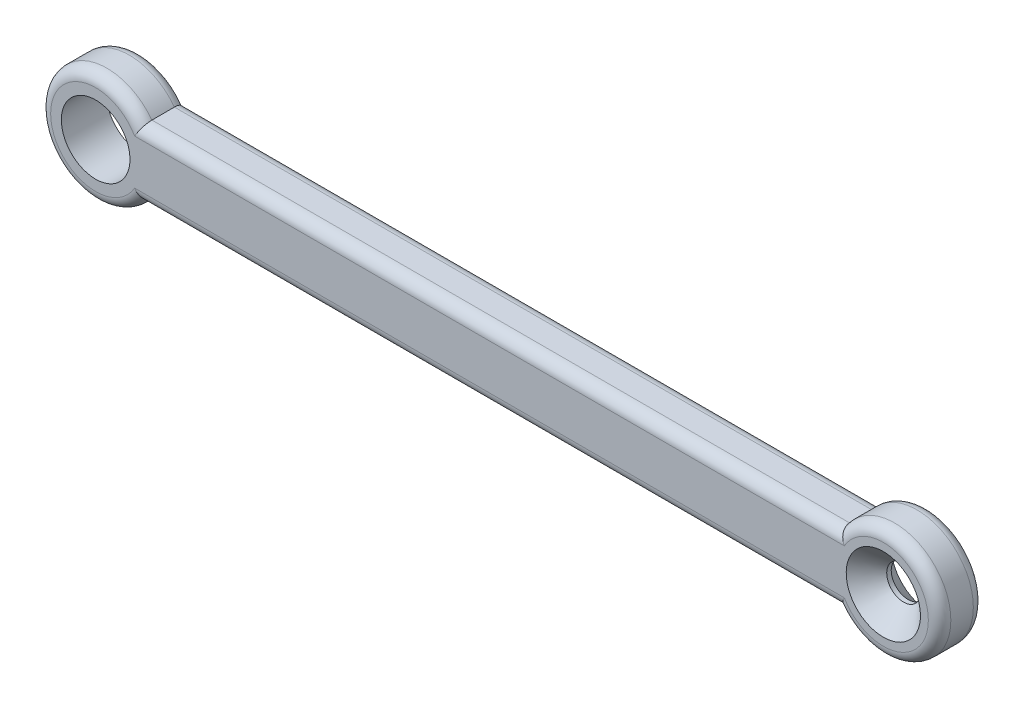
ISO-10303-21;
HEADER;
FILE_DESCRIPTION(('STEP AP214'),'2;1');
FILE_NAME('part.step','',(''),(''),'','','');
FILE_SCHEMA(('AUTOMOTIVE_DESIGN { 1 0 10303 214 1 1 1 1 }'));
ENDSEC;
DATA;
#1=APPLICATION_CONTEXT('core data for automotive mechanical design processes');
#2=APPLICATION_PROTOCOL_DEFINITION('international standard','automotive_design',2000,#1);
#3=PRODUCT_CONTEXT('',#1,'mechanical');
#4=PRODUCT('Part','Part','',(#3));
#5=PRODUCT_RELATED_PRODUCT_CATEGORY('part','',(#4));
#6=PRODUCT_DEFINITION_FORMATION('','',#4);
#7=PRODUCT_DEFINITION_CONTEXT('part definition',#1,'design');
#8=PRODUCT_DEFINITION('design','',#6,#7);
#9=PRODUCT_DEFINITION_SHAPE('','',#8);
#10=(LENGTH_UNIT() NAMED_UNIT(*) SI_UNIT(.MILLI.,.METRE.));
#11=(NAMED_UNIT(*) PLANE_ANGLE_UNIT() SI_UNIT($,.RADIAN.));
#12=(NAMED_UNIT(*) SI_UNIT($,.STERADIAN.) SOLID_ANGLE_UNIT());
#13=UNCERTAINTY_MEASURE_WITH_UNIT(LENGTH_MEASURE(1.E-05),#10,'distance_accuracy_value','');
#14=(GEOMETRIC_REPRESENTATION_CONTEXT(3) GLOBAL_UNCERTAINTY_ASSIGNED_CONTEXT((#13)) GLOBAL_UNIT_ASSIGNED_CONTEXT((#10,
#11,#12)) REPRESENTATION_CONTEXT('',''));
#15=CARTESIAN_POINT('',(0.,0.,0.));
#16=DIRECTION('',(0.,0.,1.));
#17=DIRECTION('',(1.,0.,0.));
#18=AXIS2_PLACEMENT_3D('',#15,#16,#17);
#19=CARTESIAN_POINT('',(-35.,0.,4.));
#20=DIRECTION('',(0.,0.,-1.));
#21=DIRECTION('',(-1.,0.,0.));
#22=AXIS2_PLACEMENT_3D('',#19,#20,#21);
#23=CYLINDRICAL_SURFACE('',#22,5.);
#24=DIRECTION('',(0.,0.,-1.));
#25=VECTOR('',#24,1.);
#26=CARTESIAN_POINT('',(-31.,-3.,4.));
#27=LINE('',#26,#25);
#28=CARTESIAN_POINT('',(-31.,-3.,3.));
#29=VERTEX_POINT('',#28);
#30=CARTESIAN_POINT('',(-31.,-3.,1.));
#31=VERTEX_POINT('',#30);
#32=EDGE_CURVE('E117',#29,#31,#27,.T.);
#33=ORIENTED_EDGE('',*,*,#32,.F.);
#34=CARTESIAN_POINT('',(-35.,0.,3.));
#35=DIRECTION('',(0.,0.,-1.));
#36=DIRECTION('',(-1.,0.,0.));
#37=AXIS2_PLACEMENT_3D('',#34,#35,#36);
#38=CIRCLE('',#37,5.);
#39=CARTESIAN_POINT('',(-31.,3.,3.));
#40=VERTEX_POINT('',#39);
#41=EDGE_CURVE('E133',#29,#40,#38,.T.);
#42=ORIENTED_EDGE('',*,*,#41,.T.);
#43=DIRECTION('',(0.,0.,-1.));
#44=VECTOR('',#43,1.);
#45=CARTESIAN_POINT('',(-31.,3.,4.));
#46=LINE('',#45,#44);
#47=CARTESIAN_POINT('',(-31.,3.,1.));
#48=VERTEX_POINT('',#47);
#49=EDGE_CURVE('E335',#40,#48,#46,.T.);
#50=ORIENTED_EDGE('',*,*,#49,.T.);
#51=CARTESIAN_POINT('',(-35.,0.,1.));
#52=DIRECTION('',(0.,0.,-1.));
#53=DIRECTION('',(-1.,0.,0.));
#54=AXIS2_PLACEMENT_3D('',#51,#52,#53);
#55=CIRCLE('',#54,5.);
#56=EDGE_CURVE('E136',#48,#31,#55,.F.);
#57=ORIENTED_EDGE('',*,*,#56,.T.);
#58=EDGE_LOOP('',(#33,#42,#50,#57));
#59=FACE_BOUND('',#58,.T.);
#60=ADVANCED_FACE('F39',(#59),#23,.T.);
#61=CARTESIAN_POINT('',(-31.,-3.,4.));
#62=DIRECTION('',(0.,-1.,0.));
#63=DIRECTION('',(1.,0.,0.));
#64=AXIS2_PLACEMENT_3D('',#61,#62,#63);
#65=PLANE('',#64);
#66=DIRECTION('',(0.,0.,-1.));
#67=VECTOR('',#66,1.);
#68=CARTESIAN_POINT('',(31.,-3.00000000000001,4.));
#69=LINE('',#68,#67);
#70=CARTESIAN_POINT('',(31.,-3.00000000000001,3.));
#71=VERTEX_POINT('',#70);
#72=CARTESIAN_POINT('',(31.,-3.00000000000001,1.));
#73=VERTEX_POINT('',#72);
#74=EDGE_CURVE('E120',#71,#73,#69,.T.);
#75=ORIENTED_EDGE('',*,*,#74,.F.);
#76=DIRECTION('',(-1.,0.,0.));
#77=VECTOR('',#76,1.);
#78=CARTESIAN_POINT('',(-31.,-3.,3.));
#79=LINE('',#78,#77);
#80=EDGE_CURVE('E114',#71,#29,#79,.T.);
#81=ORIENTED_EDGE('',*,*,#80,.T.);
#82=ORIENTED_EDGE('',*,*,#32,.T.);
#83=DIRECTION('',(-1.,0.,0.));
#84=VECTOR('',#83,1.);
#85=CARTESIAN_POINT('',(-31.,-3.,1.));
#86=LINE('',#85,#84);
#87=EDGE_CURVE('E127',#31,#73,#86,.F.);
#88=ORIENTED_EDGE('',*,*,#87,.T.);
#89=EDGE_LOOP('',(#75,#81,#82,#88));
#90=FACE_BOUND('',#89,.T.);
#91=ADVANCED_FACE('F116',(#90),#65,.T.);
#92=CARTESIAN_POINT('',(35.,0.,4.));
#93=DIRECTION('',(0.,0.,-1.));
#94=DIRECTION('',(-1.,0.,0.));
#95=AXIS2_PLACEMENT_3D('',#92,#93,#94);
#96=CYLINDRICAL_SURFACE('',#95,5.);
#97=DIRECTION('',(0.,0.,-1.));
#98=VECTOR('',#97,1.);
#99=CARTESIAN_POINT('',(31.,2.99999999999999,4.));
#100=LINE('',#99,#98);
#101=CARTESIAN_POINT('',(31.,2.99999999999999,3.));
#102=VERTEX_POINT('',#101);
#103=CARTESIAN_POINT('',(31.,2.99999999999999,1.));
#104=VERTEX_POINT('',#103);
#105=EDGE_CURVE('E339',#102,#104,#100,.T.);
#106=ORIENTED_EDGE('',*,*,#105,.F.);
#107=CARTESIAN_POINT('',(35.,0.,3.));
#108=DIRECTION('',(0.,0.,-1.));
#109=DIRECTION('',(-1.,0.,0.));
#110=AXIS2_PLACEMENT_3D('',#107,#108,#109);
#111=CIRCLE('',#110,5.);
#112=EDGE_CURVE('E181',#102,#71,#111,.T.);
#113=ORIENTED_EDGE('',*,*,#112,.T.);
#114=ORIENTED_EDGE('',*,*,#74,.T.);
#115=CARTESIAN_POINT('',(35.,0.,1.));
#116=DIRECTION('',(0.,0.,-1.));
#117=DIRECTION('',(-1.,0.,0.));
#118=AXIS2_PLACEMENT_3D('',#115,#116,#117);
#119=CIRCLE('',#118,5.);
#120=EDGE_CURVE('E126',#73,#104,#119,.F.);
#121=ORIENTED_EDGE('',*,*,#120,.T.);
#122=EDGE_LOOP('',(#106,#113,#114,#121));
#123=FACE_BOUND('',#122,.T.);
#124=ADVANCED_FACE('F274',(#123),#96,.T.);
#125=CARTESIAN_POINT('',(-31.,3.,4.));
#126=DIRECTION('',(0.,1.,0.));
#127=DIRECTION('',(-1.,0.,0.));
#128=AXIS2_PLACEMENT_3D('',#125,#126,#127);
#129=PLANE('',#128);
#130=ORIENTED_EDGE('',*,*,#49,.F.);
#131=DIRECTION('',(1.,0.,0.));
#132=VECTOR('',#131,1.);
#133=CARTESIAN_POINT('',(31.,2.99999999999999,3.));
#134=LINE('',#133,#132);
#135=EDGE_CURVE('E173',#40,#102,#134,.T.);
#136=ORIENTED_EDGE('',*,*,#135,.T.);
#137=ORIENTED_EDGE('',*,*,#105,.T.);
#138=DIRECTION('',(1.,0.,0.));
#139=VECTOR('',#138,1.);
#140=CARTESIAN_POINT('',(-31.,3.,1.));
#141=LINE('',#140,#139);
#142=EDGE_CURVE('E170',#104,#48,#141,.F.);
#143=ORIENTED_EDGE('',*,*,#142,.T.);
#144=EDGE_LOOP('',(#130,#136,#137,#143));
#145=FACE_BOUND('',#144,.T.);
#146=ADVANCED_FACE('F277',(#145),#129,.T.);
#147=CARTESIAN_POINT('',(-35.,0.,4.));
#148=DIRECTION('',(0.,0.,-1.));
#149=DIRECTION('',(-1.,0.,0.));
#150=AXIS2_PLACEMENT_3D('',#147,#148,#149);
#151=PLANE('',#150);
#152=DIRECTION('',(1.,0.,0.));
#153=VECTOR('',#152,1.);
#154=CARTESIAN_POINT('',(-31.,2.,4.));
#155=LINE('',#154,#153);
#156=CARTESIAN_POINT('',(31.5358983848623,1.99999999999999,4.));
#157=VERTEX_POINT('',#156);
#158=CARTESIAN_POINT('',(-31.5358983848622,2.,4.));
#159=VERTEX_POINT('',#158);
#160=EDGE_CURVE('E164',#157,#159,#155,.F.);
#161=ORIENTED_EDGE('',*,*,#160,.T.);
#162=CARTESIAN_POINT('',(-35.,0.,4.));
#163=DIRECTION('',(0.,0.,-1.));
#164=DIRECTION('',(-1.,0.,0.));
#165=AXIS2_PLACEMENT_3D('',#162,#163,#164);
#166=CIRCLE('',#165,4.);
#167=CARTESIAN_POINT('',(-31.5358983848622,-2.,4.));
#168=VERTEX_POINT('',#167);
#169=EDGE_CURVE('E167',#159,#168,#166,.F.);
#170=ORIENTED_EDGE('',*,*,#169,.T.);
#171=DIRECTION('',(-1.,0.,0.));
#172=VECTOR('',#171,1.);
#173=CARTESIAN_POINT('',(31.,-2.00000000000001,4.));
#174=LINE('',#173,#172);
#175=CARTESIAN_POINT('',(31.5358983848622,-2.00000000000001,4.));
#176=VERTEX_POINT('',#175);
#177=EDGE_CURVE('E142',#168,#176,#174,.F.);
#178=ORIENTED_EDGE('',*,*,#177,.T.);
#179=CARTESIAN_POINT('',(35.,0.,4.));
#180=DIRECTION('',(0.,0.,-1.));
#181=DIRECTION('',(-1.,0.,0.));
#182=AXIS2_PLACEMENT_3D('',#179,#180,#181);
#183=CIRCLE('',#182,4.);
#184=EDGE_CURVE('E154',#176,#157,#183,.F.);
#185=ORIENTED_EDGE('',*,*,#184,.T.);
#186=EDGE_LOOP('',(#161,#170,#178,#185));
#187=FACE_BOUND('',#186,.T.);
#188=CARTESIAN_POINT('',(35.,0.,4.));
#189=DIRECTION('',(0.,0.,1.));
#190=DIRECTION('',(0.,-1.,0.));
#191=AXIS2_PLACEMENT_3D('',#188,#189,#190);
#192=CIRCLE('',#191,3.3);
#193=CARTESIAN_POINT('',(35.,-3.30000000000001,4.));
#194=VERTEX_POINT('',#193);
#195=EDGE_CURVE('E313',#194,#194,#192,.T.);
#196=ORIENTED_EDGE('',*,*,#195,.F.);
#197=EDGE_LOOP('',(#196));
#198=FACE_BOUND('',#197,.T.);
#199=CARTESIAN_POINT('',(-35.,0.,4.));
#200=DIRECTION('',(0.,0.,1.));
#201=DIRECTION('',(0.,-1.,0.));
#202=AXIS2_PLACEMENT_3D('',#199,#200,#201);
#203=CIRCLE('',#202,3.04999999999998);
#204=CARTESIAN_POINT('',(-35.,-3.04999999999998,4.));
#205=VERTEX_POINT('',#204);
#206=EDGE_CURVE('E328',#205,#205,#203,.T.);
#207=ORIENTED_EDGE('',*,*,#206,.F.);
#208=EDGE_LOOP('',(#207));
#209=FACE_BOUND('',#208,.T.);
#210=ADVANCED_FACE('F280',(#187,#198,#209),#151,.F.);
#211=CARTESIAN_POINT('',(-35.,0.,0.));
#212=DIRECTION('',(0.,0.,-1.));
#213=DIRECTION('',(-1.,0.,0.));
#214=AXIS2_PLACEMENT_3D('',#211,#212,#213);
#215=PLANE('',#214);
#216=DIRECTION('',(1.,0.,0.));
#217=VECTOR('',#216,1.);
#218=CARTESIAN_POINT('',(-35.,2.,0.));
#219=LINE('',#218,#217);
#220=CARTESIAN_POINT('',(-31.5358983848622,2.,0.));
#221=VERTEX_POINT('',#220);
#222=CARTESIAN_POINT('',(31.5358983848623,1.99999999999999,0.));
#223=VERTEX_POINT('',#222);
#224=EDGE_CURVE('E54',#221,#223,#219,.T.);
#225=ORIENTED_EDGE('',*,*,#224,.T.);
#226=CARTESIAN_POINT('',(35.,0.,0.));
#227=DIRECTION('',(0.,0.,-1.));
#228=DIRECTION('',(-1.,0.,0.));
#229=AXIS2_PLACEMENT_3D('',#226,#227,#228);
#230=CIRCLE('',#229,4.);
#231=CARTESIAN_POINT('',(31.5358983848622,-2.00000000000001,0.));
#232=VERTEX_POINT('',#231);
#233=EDGE_CURVE('E11',#223,#232,#230,.T.);
#234=ORIENTED_EDGE('',*,*,#233,.T.);
#235=DIRECTION('',(-1.,0.,0.));
#236=VECTOR('',#235,1.);
#237=CARTESIAN_POINT('',(-35.,-2.,0.));
#238=LINE('',#237,#236);
#239=CARTESIAN_POINT('',(-31.5358983848622,-2.,0.));
#240=VERTEX_POINT('',#239);
#241=EDGE_CURVE('E187',#232,#240,#238,.T.);
#242=ORIENTED_EDGE('',*,*,#241,.T.);
#243=CARTESIAN_POINT('',(-35.,0.,0.));
#244=DIRECTION('',(0.,0.,-1.));
#245=DIRECTION('',(-1.,0.,0.));
#246=AXIS2_PLACEMENT_3D('',#243,#244,#245);
#247=CIRCLE('',#246,4.);
#248=EDGE_CURVE('E184',#240,#221,#247,.T.);
#249=ORIENTED_EDGE('',*,*,#248,.T.);
#250=EDGE_LOOP('',(#225,#234,#242,#249));
#251=FACE_BOUND('',#250,.T.);
#252=CARTESIAN_POINT('',(35.,0.,0.));
#253=DIRECTION('',(0.,0.,1.));
#254=DIRECTION('',(0.,-1.,0.));
#255=AXIS2_PLACEMENT_3D('',#252,#253,#254);
#256=CIRCLE('',#255,3.3);
#257=CARTESIAN_POINT('',(35.,-3.30000000000001,0.));
#258=VERTEX_POINT('',#257);
#259=EDGE_CURVE('E316',#258,#258,#256,.T.);
#260=ORIENTED_EDGE('',*,*,#259,.T.);
#261=EDGE_LOOP('',(#260));
#262=FACE_BOUND('',#261,.T.);
#263=CARTESIAN_POINT('',(-35.,0.,0.));
#264=DIRECTION('',(0.,0.,1.));
#265=DIRECTION('',(0.,-1.,0.));
#266=AXIS2_PLACEMENT_3D('',#263,#264,#265);
#267=CIRCLE('',#266,3.04999999999999);
#268=CARTESIAN_POINT('',(-35.,-3.04999999999999,0.));
#269=VERTEX_POINT('',#268);
#270=EDGE_CURVE('E332',#269,#269,#267,.T.);
#271=ORIENTED_EDGE('',*,*,#270,.T.);
#272=EDGE_LOOP('',(#271));
#273=FACE_BOUND('',#272,.T.);
#274=ADVANCED_FACE('F285',(#251,#262,#273),#215,.T.);
#275=CARTESIAN_POINT('',(-35.,0.,4.));
#276=DIRECTION('',(0.,0.,1.));
#277=DIRECTION('',(0.,-1.,0.));
#278=AXIS2_PLACEMENT_3D('',#275,#276,#277);
#279=CYLINDRICAL_SURFACE('',#278,3.04999999999999);
#280=ORIENTED_EDGE('',*,*,#270,.F.);
#281=EDGE_LOOP('',(#280));
#282=FACE_BOUND('',#281,.T.);
#283=ORIENTED_EDGE('',*,*,#206,.T.);
#284=EDGE_LOOP('',(#283));
#285=FACE_BOUND('',#284,.T.);
#286=ADVANCED_FACE('F288',(#282,#285),#279,.F.);
#287=CARTESIAN_POINT('',(35.,0.,1.8));
#288=DIRECTION('',(0.,0.,-1.));
#289=DIRECTION('',(0.,1.,0.));
#290=AXIS2_PLACEMENT_3D('',#287,#288,#289);
#291=CONICAL_SURFACE('',#290,1.5,0.785398163397447);
#292=ORIENTED_EDGE('',*,*,#259,.F.);
#293=EDGE_LOOP('',(#292));
#294=FACE_BOUND('',#293,.T.);
#295=CARTESIAN_POINT('',(35.,0.,1.8));
#296=DIRECTION('',(0.,0.,1.));
#297=DIRECTION('',(0.,-1.,0.));
#298=AXIS2_PLACEMENT_3D('',#295,#296,#297);
#299=CIRCLE('',#298,1.5);
#300=CARTESIAN_POINT('',(35.,-1.50000000000001,1.8));
#301=VERTEX_POINT('',#300);
#302=EDGE_CURVE('E320',#301,#301,#299,.T.);
#303=ORIENTED_EDGE('',*,*,#302,.T.);
#304=EDGE_LOOP('',(#303));
#305=FACE_BOUND('',#304,.T.);
#306=ADVANCED_FACE('F294',(#294,#305),#291,.F.);
#307=CARTESIAN_POINT('',(35.,0.,4.));
#308=DIRECTION('',(0.,0.,1.));
#309=DIRECTION('',(0.,-1.,0.));
#310=AXIS2_PLACEMENT_3D('',#307,#308,#309);
#311=CYLINDRICAL_SURFACE('',#310,1.5);
#312=ORIENTED_EDGE('',*,*,#302,.F.);
#313=EDGE_LOOP('',(#312));
#314=FACE_BOUND('',#313,.T.);
#315=CARTESIAN_POINT('',(35.,0.,2.2));
#316=DIRECTION('',(0.,0.,1.));
#317=DIRECTION('',(0.,-1.,0.));
#318=AXIS2_PLACEMENT_3D('',#315,#316,#317);
#319=CIRCLE('',#318,1.5);
#320=CARTESIAN_POINT('',(35.,-1.50000000000001,2.2));
#321=VERTEX_POINT('',#320);
#322=EDGE_CURVE('E310',#321,#321,#319,.T.);
#323=ORIENTED_EDGE('',*,*,#322,.T.);
#324=EDGE_LOOP('',(#323));
#325=FACE_BOUND('',#324,.T.);
#326=ADVANCED_FACE('F298',(#314,#325),#311,.F.);
#327=CARTESIAN_POINT('',(35.,0.,4.));
#328=DIRECTION('',(0.,0.,1.));
#329=DIRECTION('',(0.,-1.,0.));
#330=AXIS2_PLACEMENT_3D('',#327,#328,#329);
#331=CONICAL_SURFACE('',#330,3.3,0.785398163397447);
#332=ORIENTED_EDGE('',*,*,#322,.F.);
#333=EDGE_LOOP('',(#332));
#334=FACE_BOUND('',#333,.T.);
#335=ORIENTED_EDGE('',*,*,#195,.T.);
#336=EDGE_LOOP('',(#335));
#337=FACE_BOUND('',#336,.T.);
#338=ADVANCED_FACE('F231',(#334,#337),#331,.F.);
#339=CARTESIAN_POINT('',(35.,0.,3.));
#340=DIRECTION('',(0.,0.,-1.));
#341=DIRECTION('',(-1.,0.,0.));
#342=AXIS2_PLACEMENT_3D('',#339,#340,#341);
#343=TOROIDAL_SURFACE('',#342,4.,1.);
#344=CARTESIAN_POINT('',(31.,2.99999999999999,3.));
#345=CARTESIAN_POINT('',(30.9999997186835,3.00000118487758,3.02593584117217));
#346=CARTESIAN_POINT('',(31.0005048422214,2.99899024971478,3.05185848371749));
#347=CARTESIAN_POINT('',(31.0025174211415,2.9949663652297,3.10350244341266));
#348=CARTESIAN_POINT('',(31.0040246301367,2.99195390803017,3.12922380847896));
#349=CARTESIAN_POINT('',(31.0100201848329,2.97998050347588,3.20562797357342));
#350=CARTESIAN_POINT('',(31.0159826315797,2.96808309336857,3.2557718679136));
#351=CARTESIAN_POINT('',(31.0316200908392,2.93699471408966,3.35306188885311));
#352=CARTESIAN_POINT('',(31.0412933679872,2.91780715418681,3.40020940470925));
#353=CARTESIAN_POINT('',(31.0640294624263,2.87293379421446,3.49043466378816));
#354=CARTESIAN_POINT('',(31.0770940996145,2.84724450532373,3.53351020489424));
#355=CARTESIAN_POINT('',(31.1067833208305,2.7892269831718,3.61625708217515));
#356=CARTESIAN_POINT('',(31.1235261796482,2.75668016666699,3.65573197239517));
#357=CARTESIAN_POINT('',(31.1597750962425,2.6867497331279,3.72864880091133));
#358=CARTESIAN_POINT('',(31.1792818722659,2.64936485906855,3.76208916589023));
#359=CARTESIAN_POINT('',(31.2226452828904,2.56697350675941,3.82553326631048));
#360=CARTESIAN_POINT('',(31.246741407605,2.52157888102644,3.85486819768669));
#361=CARTESIAN_POINT('',(31.2971421630572,2.42763014490769,3.90553011803555));
#362=CARTESIAN_POINT('',(31.3234486667458,2.37907336308624,3.92685023024644));
#363=CARTESIAN_POINT('',(31.379466656447,2.27685685167101,3.96253254553221));
#364=CARTESIAN_POINT('',(31.4092883233148,2.2230703241737,3.97635450540737));
#365=CARTESIAN_POINT('',(31.4701463148326,2.11473605902904,3.99491079093398));
#366=CARTESIAN_POINT('',(31.5011801634543,2.06019000592373,3.99966274451616));
#367=CARTESIAN_POINT('',(31.5336334551975,2.00392392816218,3.99999423692863));
#368=CARTESIAN_POINT('',(31.5347657404586,2.0019617898671,4.00000001055694));
#369=CARTESIAN_POINT('',(31.5358983848623,1.99999999999999,4.));
#370=B_SPLINE_CURVE_WITH_KNOTS('',3,(#344,#345,#346,#347,#348,#349,#350,#351,#352,#353,#354,
#355,#356,#357,#358,#359,#360,#361,#362,#363,#364,#365,#366,#367,#368,#369),.UNSPECIFIED.,.F.,
.F.,(4,2,2,2,2,2,2,2,2,2,2,2,4),(0.,0.0777570801348416,0.155495048875958,0.310316804326361,
0.465066245681998,0.619898902143677,0.780727934079204,0.941598836856938,1.11840921049057,
1.29537094407907,1.48379700692642,1.67185648156941,1.67865268078424),.UNSPECIFIED.);
#371=EDGE_CURVE('E147',#157,#102,#370,.F.);
#372=ORIENTED_EDGE('',*,*,#371,.F.);
#373=ORIENTED_EDGE('',*,*,#184,.F.);
#374=CARTESIAN_POINT('',(31.,-3.00000000000001,3.));
#375=CARTESIAN_POINT('',(30.9999997186835,-3.00000118487759,3.02593584117217));
#376=CARTESIAN_POINT('',(31.0005048422214,-2.9989902497148,3.05185848371749));
#377=CARTESIAN_POINT('',(31.0025174211415,-2.99496636522971,3.10350244341266));
#378=CARTESIAN_POINT('',(31.0040246301367,-2.99195390803019,3.12922380847896));
#379=CARTESIAN_POINT('',(31.0100201848329,-2.9799805034759,3.20562797357342));
#380=CARTESIAN_POINT('',(31.0159826315797,-2.96808309336859,3.2557718679136));
#381=CARTESIAN_POINT('',(31.0316200908392,-2.93699471408968,3.35306188885311));
#382=CARTESIAN_POINT('',(31.0412933679872,-2.91780715418682,3.40020940470925));
#383=CARTESIAN_POINT('',(31.0640294624263,-2.87293379421448,3.49043466378816));
#384=CARTESIAN_POINT('',(31.0770940996145,-2.84724450532375,3.53351020489424));
#385=CARTESIAN_POINT('',(31.1067833208305,-2.78922698317182,3.61625708217515));
#386=CARTESIAN_POINT('',(31.1235261796482,-2.756680166667,3.65573197239517));
#387=CARTESIAN_POINT('',(31.1597750962425,-2.68674973312791,3.72864880091133));
#388=CARTESIAN_POINT('',(31.1792818722659,-2.64936485906856,3.76208916589023));
#389=CARTESIAN_POINT('',(31.2226452828904,-2.56697350675942,3.82553326631047));
#390=CARTESIAN_POINT('',(31.246741407605,-2.52157888102645,3.85486819768669));
#391=CARTESIAN_POINT('',(31.2971421630572,-2.42763014490771,3.90553011803555));
#392=CARTESIAN_POINT('',(31.3234486667458,-2.37907336308626,3.92685023024644));
#393=CARTESIAN_POINT('',(31.379466656447,-2.27685685167103,3.96253254553221));
#394=CARTESIAN_POINT('',(31.4092883233148,-2.22307032417371,3.97635450540737));
#395=CARTESIAN_POINT('',(31.4701463148326,-2.11473605902906,3.99491079093398));
#396=CARTESIAN_POINT('',(31.5011801634544,-2.06019000592378,3.99966274451616));
#397=CARTESIAN_POINT('',(31.5336334551975,-2.0039239281622,3.99999423692863));
#398=CARTESIAN_POINT('',(31.5347657404586,-2.00196178986712,4.00000001055694));
#399=CARTESIAN_POINT('',(31.5358983848622,-2.00000000000001,4.));
#400=B_SPLINE_CURVE_WITH_KNOTS('',3,(#374,#375,#376,#377,#378,#379,#380,#381,#382,#383,#384,
#385,#386,#387,#388,#389,#390,#391,#392,#393,#394,#395,#396,#397,#398,#399),.UNSPECIFIED.,.F.,
.F.,(4,2,2,2,2,2,2,2,2,2,2,2,4),(0.,0.0777570801348412,0.155495048875958,0.310316804326361,
0.465066245681997,0.619898902143676,0.780727934079201,0.941598836856936,1.11840921049057,
1.29537094407907,1.48379700692641,1.67185648156941,1.67865268078424),.UNSPECIFIED.);
#401=EDGE_CURVE('E221',#71,#176,#400,.T.);
#402=ORIENTED_EDGE('',*,*,#401,.F.);
#403=ORIENTED_EDGE('',*,*,#112,.F.);
#404=EDGE_LOOP('',(#372,#373,#402,#403));
#405=FACE_BOUND('',#404,.T.);
#406=ADVANCED_FACE('F227',(#405),#343,.T.);
#407=CARTESIAN_POINT('',(-31.,-2.,3.));
#408=DIRECTION('',(1.,0.,0.));
#409=DIRECTION('',(0.,1.,0.));
#410=AXIS2_PLACEMENT_3D('',#407,#408,#409);
#411=CYLINDRICAL_SURFACE('',#410,1.);
#412=ORIENTED_EDGE('',*,*,#401,.T.);
#413=ORIENTED_EDGE('',*,*,#177,.F.);
#414=CARTESIAN_POINT('',(-31.,-3.,3.));
#415=CARTESIAN_POINT('',(-30.9999997186835,-3.00000118487758,3.02593584117217));
#416=CARTESIAN_POINT('',(-31.0005048422214,-2.99899024971479,3.05185848371749));
#417=CARTESIAN_POINT('',(-31.0025174211415,-2.99496636522971,3.10350244341266));
#418=CARTESIAN_POINT('',(-31.0040246301367,-2.99195390803018,3.12922380847896));
#419=CARTESIAN_POINT('',(-31.0100201848329,-2.97998050347589,3.20562797357342));
#420=CARTESIAN_POINT('',(-31.0159826315797,-2.96808309336858,3.2557718679136));
#421=CARTESIAN_POINT('',(-31.0316200908392,-2.93699471408967,3.35306188885311));
#422=CARTESIAN_POINT('',(-31.0412933679872,-2.91780715418682,3.40020940470925));
#423=CARTESIAN_POINT('',(-31.0640294624263,-2.87293379421447,3.49043466378816));
#424=CARTESIAN_POINT('',(-31.0770940996145,-2.84724450532374,3.53351020489424));
#425=CARTESIAN_POINT('',(-31.1067833208305,-2.78922698317181,3.61625708217515));
#426=CARTESIAN_POINT('',(-31.1235261796482,-2.756680166667,3.65573197239517));
#427=CARTESIAN_POINT('',(-31.1597750962425,-2.6867497331279,3.72864880091133));
#428=CARTESIAN_POINT('',(-31.1792818722659,-2.64936485906855,3.76208916589023));
#429=CARTESIAN_POINT('',(-31.2226452828904,-2.56697350675941,3.82553326631047));
#430=CARTESIAN_POINT('',(-31.246741407605,-2.52157888102645,3.85486819768669));
#431=CARTESIAN_POINT('',(-31.2971421630572,-2.4276301449077,3.90553011803555));
#432=CARTESIAN_POINT('',(-31.3234486667458,-2.37907336308625,3.92685023024644));
#433=CARTESIAN_POINT('',(-31.379466656447,-2.27685685167102,3.96253254553221));
#434=CARTESIAN_POINT('',(-31.4092883233149,-2.22307032417373,3.97635450540737));
#435=CARTESIAN_POINT('',(-31.4701463148326,-2.11473605902903,3.99491079093398));
#436=CARTESIAN_POINT('',(-31.5011801634542,-2.06019000592368,3.99966274451616));
#437=CARTESIAN_POINT('',(-31.5336334551975,-2.00392392816219,3.99999423692863));
#438=CARTESIAN_POINT('',(-31.5347657404586,-2.00196178986711,4.00000001055694));
#439=CARTESIAN_POINT('',(-31.5358983848622,-2.,4.));
#440=B_SPLINE_CURVE_WITH_KNOTS('',3,(#414,#415,#416,#417,#418,#419,#420,#421,#422,#423,#424,
#425,#426,#427,#428,#429,#430,#431,#432,#433,#434,#435,#436,#437,#438,#439),.UNSPECIFIED.,.F.,
.F.,(4,2,2,2,2,2,2,2,2,2,2,2,4),(0.,0.0777570801348412,0.155495048875958,0.310316804326361,
0.465066245681997,0.619898902143676,0.780727934079203,0.941598836856936,1.11840921049057,
1.29537094407907,1.48379700692641,1.6718564815694,1.67865268078424),.UNSPECIFIED.);
#441=EDGE_CURVE('E140',#29,#168,#440,.T.);
#442=ORIENTED_EDGE('',*,*,#441,.F.);
#443=ORIENTED_EDGE('',*,*,#80,.F.);
#444=EDGE_LOOP('',(#412,#413,#442,#443));
#445=FACE_BOUND('',#444,.T.);
#446=ADVANCED_FACE('F141',(#445),#411,.T.);
#447=CARTESIAN_POINT('',(-31.,2.,3.));
#448=DIRECTION('',(-1.,0.,0.));
#449=DIRECTION('',(0.,-1.,0.));
#450=AXIS2_PLACEMENT_3D('',#447,#448,#449);
#451=CYLINDRICAL_SURFACE('',#450,1.);
#452=ORIENTED_EDGE('',*,*,#371,.T.);
#453=ORIENTED_EDGE('',*,*,#135,.F.);
#454=CARTESIAN_POINT('',(-31.,3.,3.));
#455=CARTESIAN_POINT('',(-30.9999997186835,3.00000118487758,3.02593584117217));
#456=CARTESIAN_POINT('',(-31.0005048422214,2.99899024971479,3.05185848371749));
#457=CARTESIAN_POINT('',(-31.0025174211415,2.99496636522971,3.10350244341266));
#458=CARTESIAN_POINT('',(-31.0040246301367,2.99195390803018,3.12922380847896));
#459=CARTESIAN_POINT('',(-31.0100201848329,2.97998050347589,3.20562797357342));
#460=CARTESIAN_POINT('',(-31.0159826315797,2.96808309336858,3.2557718679136));
#461=CARTESIAN_POINT('',(-31.0316200908392,2.93699471408967,3.35306188885311));
#462=CARTESIAN_POINT('',(-31.0412933679872,2.91780715418682,3.40020940470925));
#463=CARTESIAN_POINT('',(-31.0640294624263,2.87293379421447,3.49043466378816));
#464=CARTESIAN_POINT('',(-31.0770940996145,2.84724450532374,3.53351020489424));
#465=CARTESIAN_POINT('',(-31.1067833208305,2.78922698317181,3.61625708217515));
#466=CARTESIAN_POINT('',(-31.1235261796482,2.756680166667,3.65573197239517));
#467=CARTESIAN_POINT('',(-31.1597750962425,2.6867497331279,3.72864880091133));
#468=CARTESIAN_POINT('',(-31.1792818722659,2.64936485906855,3.76208916589023));
#469=CARTESIAN_POINT('',(-31.2226452828904,2.56697350675941,3.82553326631047));
#470=CARTESIAN_POINT('',(-31.246741407605,2.52157888102645,3.85486819768669));
#471=CARTESIAN_POINT('',(-31.2971421630572,2.4276301449077,3.90553011803555));
#472=CARTESIAN_POINT('',(-31.3234486667458,2.37907336308625,3.92685023024644));
#473=CARTESIAN_POINT('',(-31.379466656447,2.27685685167103,3.96253254553221));
#474=CARTESIAN_POINT('',(-31.4092883233149,2.22307032417373,3.97635450540737));
#475=CARTESIAN_POINT('',(-31.4701463148326,2.11473605902903,3.99491079093398));
#476=CARTESIAN_POINT('',(-31.5011801634542,2.06019000592368,3.99966274451616));
#477=CARTESIAN_POINT('',(-31.5336334551975,2.00392392816219,3.99999423692863));
#478=CARTESIAN_POINT('',(-31.5347657404586,2.00196178986711,4.00000001055694));
#479=CARTESIAN_POINT('',(-31.5358983848622,2.,4.));
#480=B_SPLINE_CURVE_WITH_KNOTS('',3,(#454,#455,#456,#457,#458,#459,#460,#461,#462,#463,#464,
#465,#466,#467,#468,#469,#470,#471,#472,#473,#474,#475,#476,#477,#478,#479),.UNSPECIFIED.,.F.,
.F.,(4,2,2,2,2,2,2,2,2,2,2,2,4),(0.,0.0777570801348412,0.155495048875958,0.310316804326361,
0.465066245681998,0.619898902143676,0.780727934079203,0.941598836856936,1.11840921049057,
1.29537094407907,1.48379700692641,1.6718564815694,1.67865268078424),.UNSPECIFIED.);
#481=EDGE_CURVE('E148',#159,#40,#480,.F.);
#482=ORIENTED_EDGE('',*,*,#481,.F.);
#483=ORIENTED_EDGE('',*,*,#160,.F.);
#484=EDGE_LOOP('',(#452,#453,#482,#483));
#485=FACE_BOUND('',#484,.T.);
#486=ADVANCED_FACE('F207',(#485),#451,.T.);
#487=CARTESIAN_POINT('',(-35.,0.,3.));
#488=DIRECTION('',(0.,0.,-1.));
#489=DIRECTION('',(-1.,0.,0.));
#490=AXIS2_PLACEMENT_3D('',#487,#488,#489);
#491=TOROIDAL_SURFACE('',#490,4.,1.);
#492=ORIENTED_EDGE('',*,*,#441,.T.);
#493=ORIENTED_EDGE('',*,*,#169,.F.);
#494=ORIENTED_EDGE('',*,*,#481,.T.);
#495=ORIENTED_EDGE('',*,*,#41,.F.);
#496=EDGE_LOOP('',(#492,#493,#494,#495));
#497=FACE_BOUND('',#496,.T.);
#498=ADVANCED_FACE('F150',(#497),#491,.T.);
#499=CARTESIAN_POINT('',(-35.,0.,1.));
#500=DIRECTION('',(0.,0.,-1.));
#501=DIRECTION('',(-1.,0.,0.));
#502=AXIS2_PLACEMENT_3D('',#499,#500,#501);
#503=TOROIDAL_SURFACE('',#502,4.,1.);
#504=CARTESIAN_POINT('',(-31.,-3.,1.));
#505=CARTESIAN_POINT('',(-30.9999997186835,-3.00000118487758,0.97406415882783));
#506=CARTESIAN_POINT('',(-31.0005048422214,-2.99899024971479,0.948141516282508));
#507=CARTESIAN_POINT('',(-31.0025174211415,-2.99496636522971,0.896497556587339));
#508=CARTESIAN_POINT('',(-31.0040246301367,-2.99195390803018,0.87077619152104));
#509=CARTESIAN_POINT('',(-31.0100201848329,-2.97998050347589,0.794372026426581));
#510=CARTESIAN_POINT('',(-31.0159826315797,-2.96808309336858,0.744228132086403));
#511=CARTESIAN_POINT('',(-31.0316200908392,-2.93699471408967,0.64693811114689));
#512=CARTESIAN_POINT('',(-31.0412933679872,-2.91780715418682,0.599790595290746));
#513=CARTESIAN_POINT('',(-31.0640294624263,-2.87293379421447,0.50956533621184));
#514=CARTESIAN_POINT('',(-31.0770940996145,-2.84724450532374,0.46648979510576));
#515=CARTESIAN_POINT('',(-31.1067833208305,-2.78922698317181,0.383742917824848));
#516=CARTESIAN_POINT('',(-31.1235261796482,-2.756680166667,0.344268027604829));
#517=CARTESIAN_POINT('',(-31.1597750962425,-2.68674973312791,0.271351199088675));
#518=CARTESIAN_POINT('',(-31.1792818722659,-2.64936485906856,0.237910834109767));
#519=CARTESIAN_POINT('',(-31.2226452828904,-2.56697350675941,0.174466733689526));
#520=CARTESIAN_POINT('',(-31.246741407605,-2.52157888102644,0.145131802313308));
#521=CARTESIAN_POINT('',(-31.2971421630572,-2.42763014490771,0.0944698819644536));
#522=CARTESIAN_POINT('',(-31.3234486667458,-2.37907336308626,0.0731497697535603));
#523=CARTESIAN_POINT('',(-31.379466656447,-2.27685685167101,0.0374674544677936));
#524=CARTESIAN_POINT('',(-31.4092883233147,-2.22307032417366,0.023645494592627));
#525=CARTESIAN_POINT('',(-31.4701463148327,-2.11473605902911,0.00508920906601575));
#526=CARTESIAN_POINT('',(-31.5011801634547,-2.06019000592394,0.00033725548383842));
#527=CARTESIAN_POINT('',(-31.5336334551975,-2.0039239281622,5.76307137266479E-06));
#528=CARTESIAN_POINT('',(-31.5347657404586,-2.00196178986712,-1.05569419422656E-08));
#529=CARTESIAN_POINT('',(-31.5358983848622,-2.,0.));
#530=B_SPLINE_CURVE_WITH_KNOTS('',3,(#504,#505,#506,#507,#508,#509,#510,#511,#512,#513,#514,
#515,#516,#517,#518,#519,#520,#521,#522,#523,#524,#525,#526,#527,#528,#529),.UNSPECIFIED.,.F.,
.F.,(4,2,2,2,2,2,2,2,2,2,2,2,4),(0.,0.0777570801348412,0.155495048875957,0.310316804326361,
0.465066245681998,0.619898902143677,0.7807279340792,0.941598836856936,1.11840921049057,
1.29537094407907,1.48379700692641,1.6718564815694,1.67865268078424),.UNSPECIFIED.);
#531=EDGE_CURVE('E248',#31,#240,#530,.T.);
#532=ORIENTED_EDGE('',*,*,#531,.F.);
#533=ORIENTED_EDGE('',*,*,#56,.F.);
#534=CARTESIAN_POINT('',(-31.,3.,1.));
#535=CARTESIAN_POINT('',(-30.9999997186835,3.00000118487758,0.97406415882783));
#536=CARTESIAN_POINT('',(-31.0005048422214,2.99899024971479,0.948141516282508));
#537=CARTESIAN_POINT('',(-31.0025174211415,2.99496636522971,0.896497556587339));
#538=CARTESIAN_POINT('',(-31.0040246301367,2.99195390803018,0.87077619152104));
#539=CARTESIAN_POINT('',(-31.0100201848329,2.97998050347589,0.794372026426582));
#540=CARTESIAN_POINT('',(-31.0159826315797,2.96808309336858,0.744228132086403));
#541=CARTESIAN_POINT('',(-31.0316200908392,2.93699471408967,0.64693811114689));
#542=CARTESIAN_POINT('',(-31.0412933679872,2.91780715418682,0.599790595290746));
#543=CARTESIAN_POINT('',(-31.0640294624263,2.87293379421447,0.509565336211841));
#544=CARTESIAN_POINT('',(-31.0770940996145,2.84724450532374,0.46648979510576));
#545=CARTESIAN_POINT('',(-31.1067833208305,2.78922698317181,0.383742917824848));
#546=CARTESIAN_POINT('',(-31.1235261796482,2.756680166667,0.344268027604828));
#547=CARTESIAN_POINT('',(-31.1597750962425,2.6867497331279,0.271351199088674));
#548=CARTESIAN_POINT('',(-31.1792818722659,2.64936485906856,0.237910834109767));
#549=CARTESIAN_POINT('',(-31.2226452828904,2.56697350675941,0.174466733689526));
#550=CARTESIAN_POINT('',(-31.246741407605,2.52157888102644,0.145131802313309));
#551=CARTESIAN_POINT('',(-31.2971421630572,2.42763014490771,0.0944698819644542));
#552=CARTESIAN_POINT('',(-31.3234486667458,2.37907336308626,0.0731497697535609));
#553=CARTESIAN_POINT('',(-31.379466656447,2.27685685167101,0.0374674544677939));
#554=CARTESIAN_POINT('',(-31.4092883233148,2.22307032417368,0.0236454945926265));
#555=CARTESIAN_POINT('',(-31.4701463148327,2.11473605902908,0.00508920906601572));
#556=CARTESIAN_POINT('',(-31.5011801634545,2.06019000592387,0.000337255483839437));
#557=CARTESIAN_POINT('',(-31.5336334551975,2.0039239281622,5.76307137273529E-06));
#558=CARTESIAN_POINT('',(-31.5347657404586,2.00196178986712,-1.05569419072234E-08));
#559=CARTESIAN_POINT('',(-31.5358983848622,2.,0.));
#560=B_SPLINE_CURVE_WITH_KNOTS('',3,(#534,#535,#536,#537,#538,#539,#540,#541,#542,#543,#544,
#545,#546,#547,#548,#549,#550,#551,#552,#553,#554,#555,#556,#557,#558,#559),.UNSPECIFIED.,.F.,
.F.,(4,2,2,2,2,2,2,2,2,2,2,2,4),(0.,0.0777570801348411,0.155495048875957,0.310316804326361,
0.465066245681998,0.619898902143677,0.780727934079201,0.941598836856936,1.11840921049057,
1.29537094407907,1.48379700692641,1.6718564815694,1.67865268078424),.UNSPECIFIED.);
#561=EDGE_CURVE('E44',#221,#48,#560,.F.);
#562=ORIENTED_EDGE('',*,*,#561,.F.);
#563=ORIENTED_EDGE('',*,*,#248,.F.);
#564=EDGE_LOOP('',(#532,#533,#562,#563));
#565=FACE_BOUND('',#564,.T.);
#566=ADVANCED_FACE('F41',(#565),#503,.T.);
#567=CARTESIAN_POINT('',(-35.,2.,1.));
#568=DIRECTION('',(1.,0.,0.));
#569=DIRECTION('',(0.,1.,0.));
#570=AXIS2_PLACEMENT_3D('',#567,#568,#569);
#571=CYLINDRICAL_SURFACE('',#570,1.);
#572=ORIENTED_EDGE('',*,*,#561,.T.);
#573=ORIENTED_EDGE('',*,*,#142,.F.);
#574=CARTESIAN_POINT('',(31.,2.99999999999999,1.));
#575=CARTESIAN_POINT('',(30.9999997186835,3.00000118487758,0.97406415882783));
#576=CARTESIAN_POINT('',(31.0005048422214,2.99899024971478,0.948141516282508));
#577=CARTESIAN_POINT('',(31.0025174211415,2.9949663652297,0.896497556587339));
#578=CARTESIAN_POINT('',(31.0040246301367,2.99195390803017,0.87077619152104));
#579=CARTESIAN_POINT('',(31.0100201848329,2.97998050347588,0.794372026426581));
#580=CARTESIAN_POINT('',(31.0159826315797,2.96808309336857,0.744228132086403));
#581=CARTESIAN_POINT('',(31.0316200908392,2.93699471408966,0.64693811114689));
#582=CARTESIAN_POINT('',(31.0412933679872,2.91780715418681,0.599790595290746));
#583=CARTESIAN_POINT('',(31.0640294624263,2.87293379421446,0.50956533621184));
#584=CARTESIAN_POINT('',(31.0770940996145,2.84724450532373,0.46648979510576));
#585=CARTESIAN_POINT('',(31.1067833208305,2.7892269831718,0.383742917824848));
#586=CARTESIAN_POINT('',(31.1235261796482,2.75668016666699,0.344268027604827));
#587=CARTESIAN_POINT('',(31.1597750962425,2.6867497331279,0.271351199088674));
#588=CARTESIAN_POINT('',(31.1792818722659,2.64936485906855,0.237910834109767));
#589=CARTESIAN_POINT('',(31.2226452828904,2.5669735067594,0.174466733689525));
#590=CARTESIAN_POINT('',(31.246741407605,2.52157888102643,0.145131802313307));
#591=CARTESIAN_POINT('',(31.2971421630572,2.4276301449077,0.094469881964453));
#592=CARTESIAN_POINT('',(31.3234486667458,2.37907336308625,0.0731497697535606));
#593=CARTESIAN_POINT('',(31.379466656447,2.27685685167101,0.0374674544677946));
#594=CARTESIAN_POINT('',(31.4092883233148,2.22307032417368,0.0236454945926275));
#595=CARTESIAN_POINT('',(31.4701463148327,2.11473605902907,0.00508920906601567));
#596=CARTESIAN_POINT('',(31.5011801634545,2.06019000592383,0.000337255483838314));
#597=CARTESIAN_POINT('',(31.5336334551975,2.00392392816219,5.76307137265454E-06));
#598=CARTESIAN_POINT('',(31.5347657404586,2.00196178986711,-1.05569419489164E-08));
#599=CARTESIAN_POINT('',(31.5358983848623,1.99999999999999,0.));
#600=B_SPLINE_CURVE_WITH_KNOTS('',3,(#574,#575,#576,#577,#578,#579,#580,#581,#582,#583,#584,
#585,#586,#587,#588,#589,#590,#591,#592,#593,#594,#595,#596,#597,#598,#599),.UNSPECIFIED.,.F.,
.F.,(4,2,2,2,2,2,2,2,2,2,2,2,4),(0.,0.0777570801348412,0.155495048875958,0.310316804326361,
0.465066245681998,0.619898902143677,0.780727934079204,0.941598836856938,1.11840921049057,
1.29537094407907,1.4837970069264,1.6718564815694,1.67865268078424),.UNSPECIFIED.);
#601=EDGE_CURVE('E255',#223,#104,#600,.F.);
#602=ORIENTED_EDGE('',*,*,#601,.F.);
#603=ORIENTED_EDGE('',*,*,#224,.F.);
#604=EDGE_LOOP('',(#572,#573,#602,#603));
#605=FACE_BOUND('',#604,.T.);
#606=ADVANCED_FACE('F239',(#605),#571,.T.);
#607=CARTESIAN_POINT('',(-35.,-2.,1.));
#608=DIRECTION('',(-1.,0.,0.));
#609=DIRECTION('',(0.,-1.,0.));
#610=AXIS2_PLACEMENT_3D('',#607,#608,#609);
#611=CYLINDRICAL_SURFACE('',#610,1.);
#612=ORIENTED_EDGE('',*,*,#531,.T.);
#613=ORIENTED_EDGE('',*,*,#241,.F.);
#614=CARTESIAN_POINT('',(31.,-3.00000000000001,1.));
#615=CARTESIAN_POINT('',(30.9999997186835,-3.00000118487759,0.97406415882783));
#616=CARTESIAN_POINT('',(31.0005048422214,-2.9989902497148,0.948141516282508));
#617=CARTESIAN_POINT('',(31.0025174211415,-2.99496636522971,0.896497556587339));
#618=CARTESIAN_POINT('',(31.0040246301367,-2.99195390803019,0.87077619152104));
#619=CARTESIAN_POINT('',(31.0100201848329,-2.9799805034759,0.794372026426581));
#620=CARTESIAN_POINT('',(31.0159826315797,-2.96808309336859,0.744228132086403));
#621=CARTESIAN_POINT('',(31.0316200908392,-2.93699471408968,0.64693811114689));
#622=CARTESIAN_POINT('',(31.0412933679872,-2.91780715418682,0.599790595290745));
#623=CARTESIAN_POINT('',(31.0640294624263,-2.87293379421448,0.50956533621184));
#624=CARTESIAN_POINT('',(31.0770940996145,-2.84724450532375,0.46648979510576));
#625=CARTESIAN_POINT('',(31.1067833208305,-2.78922698317182,0.383742917824848));
#626=CARTESIAN_POINT('',(31.1235261796482,-2.756680166667,0.344268027604828));
#627=CARTESIAN_POINT('',(31.1597750962425,-2.68674973312791,0.271351199088674));
#628=CARTESIAN_POINT('',(31.1792818722659,-2.64936485906856,0.237910834109767));
#629=CARTESIAN_POINT('',(31.2226452828904,-2.56697350675942,0.174466733689525));
#630=CARTESIAN_POINT('',(31.246741407605,-2.52157888102645,0.145131802313307));
#631=CARTESIAN_POINT('',(31.2971421630572,-2.42763014490771,0.0944698819644528));
#632=CARTESIAN_POINT('',(31.3234486667458,-2.37907336308628,0.0731497697535603));
#633=CARTESIAN_POINT('',(31.379466656447,-2.27685685167101,0.0374674544677939));
#634=CARTESIAN_POINT('',(31.4092883233147,-2.22307032417365,0.0236454945926268));
#635=CARTESIAN_POINT('',(31.4701463148328,-2.11473605902913,0.00508920906601564));
#636=CARTESIAN_POINT('',(31.5011801634548,-2.06019000592402,0.000337255483838627));
#637=CARTESIAN_POINT('',(31.5336334551975,-2.00392392816221,5.7630713726835E-06));
#638=CARTESIAN_POINT('',(31.5347657404586,-2.00196178986713,-1.05569419309089E-08));
#639=CARTESIAN_POINT('',(31.5358983848622,-2.00000000000001,0.));
#640=B_SPLINE_CURVE_WITH_KNOTS('',3,(#614,#615,#616,#617,#618,#619,#620,#621,#622,#623,#624,
#625,#626,#627,#628,#629,#630,#631,#632,#633,#634,#635,#636,#637,#638,#639),.UNSPECIFIED.,.F.,
.F.,(4,2,2,2,2,2,2,2,2,2,2,2,4),(0.,0.0777570801348412,0.155495048875957,0.310316804326361,
0.465066245681999,0.619898902143676,0.780727934079201,0.941598836856936,1.11840921049057,
1.29537094407907,1.48379700692641,1.6718564815694,1.67865268078424),.UNSPECIFIED.);
#641=EDGE_CURVE('E68',#73,#232,#640,.T.);
#642=ORIENTED_EDGE('',*,*,#641,.F.);
#643=ORIENTED_EDGE('',*,*,#87,.F.);
#644=EDGE_LOOP('',(#612,#613,#642,#643));
#645=FACE_BOUND('',#644,.T.);
#646=ADVANCED_FACE('F233',(#645),#611,.T.);
#647=CARTESIAN_POINT('',(35.,0.,1.));
#648=DIRECTION('',(0.,0.,-1.));
#649=DIRECTION('',(-1.,0.,0.));
#650=AXIS2_PLACEMENT_3D('',#647,#648,#649);
#651=TOROIDAL_SURFACE('',#650,4.,1.);
#652=ORIENTED_EDGE('',*,*,#601,.T.);
#653=ORIENTED_EDGE('',*,*,#120,.F.);
#654=ORIENTED_EDGE('',*,*,#641,.T.);
#655=ORIENTED_EDGE('',*,*,#233,.F.);
#656=EDGE_LOOP('',(#652,#653,#654,#655));
#657=FACE_BOUND('',#656,.T.);
#658=ADVANCED_FACE('F238',(#657),#651,.T.);
#659=CLOSED_SHELL('',(#60,#91,#124,#146,#210,#274,#286,#306,#326,#338,#406,#446,#486,#498,#566,
#606,#646,#658));
#660=MANIFOLD_SOLID_BREP('B2',#659);
#661=ADVANCED_BREP_SHAPE_REPRESENTATION('',(#18,#660),#14);
#662=SHAPE_DEFINITION_REPRESENTATION(#9,#661);
ENDSEC;
END-ISO-10303-21;
